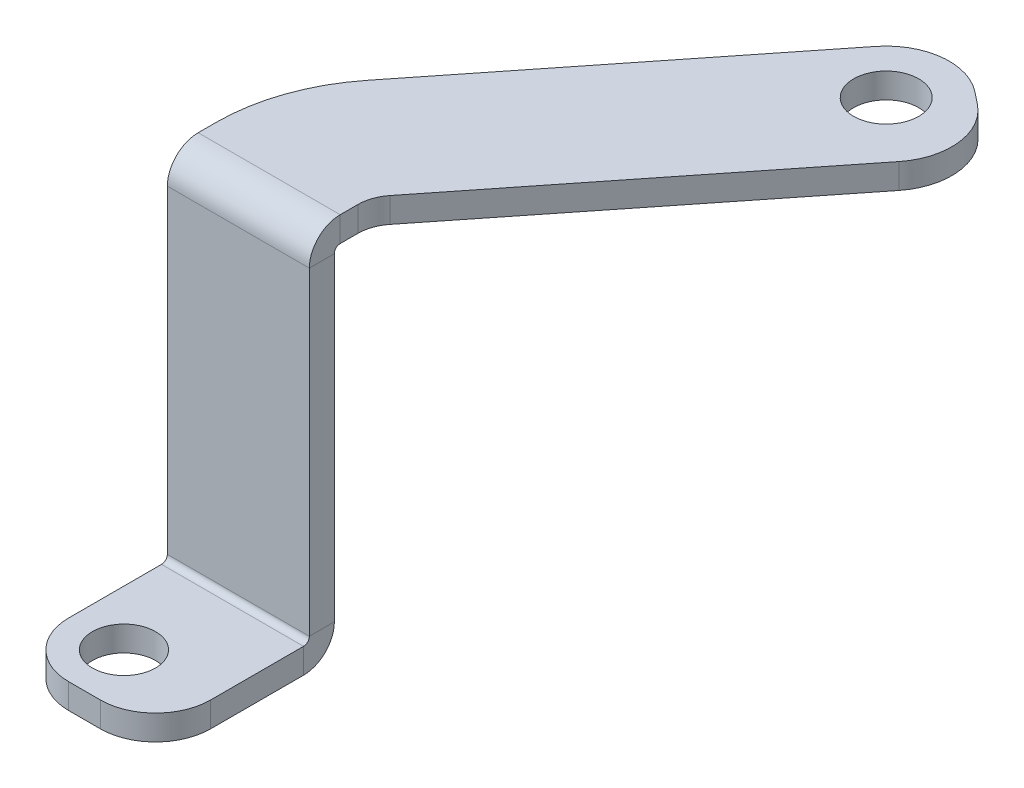
ISO-10303-21;
HEADER;
FILE_DESCRIPTION(('STEP AP214'),'2;1');
FILE_NAME('part.step','',(''),(''),'','','');
FILE_SCHEMA(('AUTOMOTIVE_DESIGN { 1 0 10303 214 1 1 1 1 }'));
ENDSEC;
DATA;
#1=APPLICATION_CONTEXT('core data for automotive mechanical design processes');
#2=APPLICATION_PROTOCOL_DEFINITION('international standard','automotive_design',2000,#1);
#3=PRODUCT_CONTEXT('',#1,'mechanical');
#4=PRODUCT('Part','Part','',(#3));
#5=PRODUCT_RELATED_PRODUCT_CATEGORY('part','',(#4));
#6=PRODUCT_DEFINITION_FORMATION('','',#4);
#7=PRODUCT_DEFINITION_CONTEXT('part definition',#1,'design');
#8=PRODUCT_DEFINITION('design','',#6,#7);
#9=PRODUCT_DEFINITION_SHAPE('','',#8);
#10=(LENGTH_UNIT() NAMED_UNIT(*) SI_UNIT(.MILLI.,.METRE.));
#11=(NAMED_UNIT(*) PLANE_ANGLE_UNIT() SI_UNIT($,.RADIAN.));
#12=(NAMED_UNIT(*) SI_UNIT($,.STERADIAN.) SOLID_ANGLE_UNIT());
#13=UNCERTAINTY_MEASURE_WITH_UNIT(LENGTH_MEASURE(1.E-05),#10,'distance_accuracy_value','');
#14=(GEOMETRIC_REPRESENTATION_CONTEXT(3) GLOBAL_UNCERTAINTY_ASSIGNED_CONTEXT((#13)) GLOBAL_UNIT_ASSIGNED_CONTEXT((#10,
#11,#12)) REPRESENTATION_CONTEXT('',''));
#15=CARTESIAN_POINT('',(0.,0.,0.));
#16=DIRECTION('',(0.,0.,1.));
#17=DIRECTION('',(1.,0.,0.));
#18=AXIS2_PLACEMENT_3D('',#15,#16,#17);
#19=CARTESIAN_POINT('',(11.,0.,-15.675));
#20=DIRECTION('',(-1.,0.,0.));
#21=DIRECTION('',(0.,0.,1.));
#22=AXIS2_PLACEMENT_3D('',#19,#20,#21);
#23=PLANE('',#22);
#24=DIRECTION('',(0.,0.,1.));
#25=VECTOR('',#24,1.);
#26=CARTESIAN_POINT('',(11.,41.1509000000002,-15.6750000000001));
#27=LINE('',#26,#25);
#28=CARTESIAN_POINT('',(11.,41.1509000000002,-15.6750000000001));
#29=VERTEX_POINT('',#28);
#30=CARTESIAN_POINT('',(11.,41.1509000000002,-12.5000000000001));
#31=VERTEX_POINT('',#30);
#32=EDGE_CURVE('E284',#29,#31,#27,.T.);
#33=ORIENTED_EDGE('',*,*,#32,.T.);
#34=DIRECTION('',(0.,-1.,0.));
#35=VECTOR('',#34,1.);
#36=CARTESIAN_POINT('',(11.,0.,-12.5));
#37=LINE('',#36,#35);
#38=CARTESIAN_POINT('',(11.,0.736599999999989,-12.5));
#39=VERTEX_POINT('',#38);
#40=EDGE_CURVE('E309',#31,#39,#37,.T.);
#41=ORIENTED_EDGE('',*,*,#40,.T.);
#42=DIRECTION('',(0.,0.,-1.));
#43=VECTOR('',#42,1.);
#44=CARTESIAN_POINT('',(11.,0.736599999999997,-12.5));
#45=LINE('',#44,#43);
#46=CARTESIAN_POINT('',(11.,0.736599999999978,-15.675));
#47=VERTEX_POINT('',#46);
#48=EDGE_CURVE('E296',#39,#47,#45,.T.);
#49=ORIENTED_EDGE('',*,*,#48,.T.);
#50=DIRECTION('',(0.,-1.,0.));
#51=VECTOR('',#50,1.);
#52=CARTESIAN_POINT('',(11.,0.,-15.675));
#53=LINE('',#52,#51);
#54=EDGE_CURVE('E310',#29,#47,#53,.T.);
#55=ORIENTED_EDGE('',*,*,#54,.F.);
#56=EDGE_LOOP('',(#33,#41,#49,#55));
#57=FACE_BOUND('',#56,.T.);
#58=ADVANCED_FACE('F43',(#57),#23,.F.);
#59=CARTESIAN_POINT('',(-7.,41.8875000000002,-15.6750000000001));
#60=DIRECTION('',(1.,0.,0.));
#61=DIRECTION('',(0.,0.,-1.));
#62=AXIS2_PLACEMENT_3D('',#59,#60,#61);
#63=PLANE('',#62);
#64=DIRECTION('',(0.,0.,1.));
#65=VECTOR('',#64,1.);
#66=CARTESIAN_POINT('',(-7.,41.1509000000002,-15.6750000000001));
#67=LINE('',#66,#65);
#68=CARTESIAN_POINT('',(-7.,41.1509000000002,-15.6750000000001));
#69=VERTEX_POINT('',#68);
#70=CARTESIAN_POINT('',(-7.,41.1509000000002,-12.5000000000001));
#71=VERTEX_POINT('',#70);
#72=EDGE_CURVE('E294',#69,#71,#67,.T.);
#73=ORIENTED_EDGE('',*,*,#72,.F.);
#74=DIRECTION('',(0.,1.,0.));
#75=VECTOR('',#74,1.);
#76=CARTESIAN_POINT('',(-7.,41.8875000000002,-15.6750000000001));
#77=LINE('',#76,#75);
#78=CARTESIAN_POINT('',(-7.,0.736600000000017,-15.675));
#79=VERTEX_POINT('',#78);
#80=EDGE_CURVE('E312',#79,#69,#77,.T.);
#81=ORIENTED_EDGE('',*,*,#80,.F.);
#82=DIRECTION('',(0.,0.,-1.));
#83=VECTOR('',#82,1.);
#84=CARTESIAN_POINT('',(-7.,0.736599999999995,-12.5));
#85=LINE('',#84,#83);
#86=CARTESIAN_POINT('',(-7.,0.736599999999988,-12.5));
#87=VERTEX_POINT('',#86);
#88=EDGE_CURVE('E301',#87,#79,#85,.T.);
#89=ORIENTED_EDGE('',*,*,#88,.F.);
#90=DIRECTION('',(0.,1.,0.));
#91=VECTOR('',#90,1.);
#92=CARTESIAN_POINT('',(-7.,41.8875000000002,-12.5000000000001));
#93=LINE('',#92,#91);
#94=EDGE_CURVE('E313',#87,#71,#93,.T.);
#95=ORIENTED_EDGE('',*,*,#94,.T.);
#96=EDGE_LOOP('',(#73,#81,#89,#95));
#97=FACE_BOUND('',#96,.T.);
#98=ADVANCED_FACE('F417',(#97),#63,.F.);
#99=CARTESIAN_POINT('',(0.,0.,-15.675));
#100=DIRECTION('',(0.,0.,1.));
#101=DIRECTION('',(0.,-1.,0.));
#102=AXIS2_PLACEMENT_3D('',#99,#100,#101);
#103=PLANE('',#102);
#104=DIRECTION('',(1.,0.,0.));
#105=VECTOR('',#104,1.);
#106=CARTESIAN_POINT('',(11.,41.1509000000002,-15.6750000000001));
#107=LINE('',#106,#105);
#108=EDGE_CURVE('E290',#29,#69,#107,.F.);
#109=ORIENTED_EDGE('',*,*,#108,.F.);
#110=ORIENTED_EDGE('',*,*,#54,.T.);
#111=DIRECTION('',(1.,0.,0.));
#112=VECTOR('',#111,1.);
#113=CARTESIAN_POINT('',(0.,0.736600000000018,-15.675));
#114=LINE('',#113,#112);
#115=EDGE_CURVE('E304',#79,#47,#114,.T.);
#116=ORIENTED_EDGE('',*,*,#115,.F.);
#117=ORIENTED_EDGE('',*,*,#80,.T.);
#118=EDGE_LOOP('',(#109,#110,#116,#117));
#119=FACE_BOUND('',#118,.T.);
#120=ADVANCED_FACE('F420',(#119),#103,.F.);
#121=CARTESIAN_POINT('',(0.,0.,-12.5));
#122=DIRECTION('',(0.,0.,1.));
#123=DIRECTION('',(0.,-1.,0.));
#124=AXIS2_PLACEMENT_3D('',#121,#122,#123);
#125=PLANE('',#124);
#126=ORIENTED_EDGE('',*,*,#40,.F.);
#127=DIRECTION('',(1.,0.,0.));
#128=VECTOR('',#127,1.);
#129=CARTESIAN_POINT('',(11.,41.1509000000002,-12.5000000000001));
#130=LINE('',#129,#128);
#131=EDGE_CURVE('E279',#31,#71,#130,.F.);
#132=ORIENTED_EDGE('',*,*,#131,.T.);
#133=ORIENTED_EDGE('',*,*,#94,.F.);
#134=DIRECTION('',(-1.,0.,0.));
#135=VECTOR('',#134,1.);
#136=CARTESIAN_POINT('',(11.,0.736599999999997,-12.5));
#137=LINE('',#136,#135);
#138=EDGE_CURVE('E299',#39,#87,#137,.T.);
#139=ORIENTED_EDGE('',*,*,#138,.F.);
#140=EDGE_LOOP('',(#126,#132,#133,#139));
#141=FACE_BOUND('',#140,.T.);
#142=ADVANCED_FACE('F408',(#141),#125,.T.);
#143=CARTESIAN_POINT('',(-7.,-3.175,-12.5));
#144=DIRECTION('',(-1.,0.,0.));
#145=DIRECTION('',(0.,0.,1.));
#146=AXIS2_PLACEMENT_3D('',#143,#144,#145);
#147=PLANE('',#146);
#148=DIRECTION('',(0.,0.,1.));
#149=VECTOR('',#148,1.);
#150=CARTESIAN_POINT('',(-7.,0.,-12.5));
#151=LINE('',#150,#149);
#152=CARTESIAN_POINT('',(-7.,0.,-11.7634));
#153=VERTEX_POINT('',#152);
#154=CARTESIAN_POINT('',(-7.,0.,0.));
#155=VERTEX_POINT('',#154);
#156=EDGE_CURVE('E344',#153,#155,#151,.T.);
#157=ORIENTED_EDGE('',*,*,#156,.F.);
#158=DIRECTION('',(0.,-1.,0.));
#159=VECTOR('',#158,1.);
#160=CARTESIAN_POINT('',(-7.,0.,-11.7634));
#161=LINE('',#160,#159);
#162=CARTESIAN_POINT('',(-7.,-3.17500000000001,-11.7634));
#163=VERTEX_POINT('',#162);
#164=EDGE_CURVE('E326',#153,#163,#161,.T.);
#165=ORIENTED_EDGE('',*,*,#164,.T.);
#166=DIRECTION('',(0.,0.,1.));
#167=VECTOR('',#166,1.);
#168=CARTESIAN_POINT('',(-7.,-3.175,-12.5));
#169=LINE('',#168,#167);
#170=CARTESIAN_POINT('',(-7.,-3.175,0.));
#171=VERTEX_POINT('',#170);
#172=EDGE_CURVE('E347',#163,#171,#169,.T.);
#173=ORIENTED_EDGE('',*,*,#172,.T.);
#174=DIRECTION('',(0.,1.,0.));
#175=VECTOR('',#174,1.);
#176=CARTESIAN_POINT('',(-7.,-3.175,0.));
#177=LINE('',#176,#175);
#178=EDGE_CURVE('E47',#171,#155,#177,.T.);
#179=ORIENTED_EDGE('',*,*,#178,.T.);
#180=EDGE_LOOP('',(#157,#165,#173,#179));
#181=FACE_BOUND('',#180,.T.);
#182=ADVANCED_FACE('F45',(#181),#147,.T.);
#183=CARTESIAN_POINT('',(0.,-3.175,0.));
#184=DIRECTION('',(0.,1.,0.));
#185=DIRECTION('',(0.,0.,1.));
#186=AXIS2_PLACEMENT_3D('',#183,#184,#185);
#187=PLANE('',#186);
#188=CARTESIAN_POINT('',(0.,-3.175,0.));
#189=DIRECTION('',(0.,1.,0.));
#190=DIRECTION('',(0.,0.,1.));
#191=AXIS2_PLACEMENT_3D('',#188,#189,#190);
#192=CIRCLE('',#191,4.);
#193=CARTESIAN_POINT('',(0.,-3.175,4.));
#194=VERTEX_POINT('',#193);
#195=EDGE_CURVE('E341',#194,#194,#192,.T.);
#196=ORIENTED_EDGE('',*,*,#195,.T.);
#197=EDGE_LOOP('',(#196));
#198=FACE_BOUND('',#197,.T.);
#199=DIRECTION('',(-1.,0.,0.));
#200=VECTOR('',#199,1.);
#201=CARTESIAN_POINT('',(-7.,-3.17500000000001,-11.7634));
#202=LINE('',#201,#200);
#203=CARTESIAN_POINT('',(11.,-3.175,-11.7634));
#204=VERTEX_POINT('',#203);
#205=EDGE_CURVE('E320',#163,#204,#202,.F.);
#206=ORIENTED_EDGE('',*,*,#205,.T.);
#207=DIRECTION('',(0.,0.,-1.));
#208=VECTOR('',#207,1.);
#209=CARTESIAN_POINT('',(11.,-3.175,0.));
#210=LINE('',#209,#208);
#211=CARTESIAN_POINT('',(11.,-3.175,0.));
#212=VERTEX_POINT('',#211);
#213=EDGE_CURVE('E359',#212,#204,#210,.T.);
#214=ORIENTED_EDGE('',*,*,#213,.F.);
#215=CARTESIAN_POINT('',(4.,-3.175,0.));
#216=DIRECTION('',(0.,1.,0.));
#217=DIRECTION('',(0.,0.,1.));
#218=AXIS2_PLACEMENT_3D('',#215,#216,#217);
#219=CIRCLE('',#218,7.);
#220=CARTESIAN_POINT('',(4.,-3.175,7.));
#221=VERTEX_POINT('',#220);
#222=EDGE_CURVE('E356',#221,#212,#219,.T.);
#223=ORIENTED_EDGE('',*,*,#222,.F.);
#224=DIRECTION('',(1.,0.,0.));
#225=VECTOR('',#224,1.);
#226=CARTESIAN_POINT('',(0.,-3.175,7.));
#227=LINE('',#226,#225);
#228=CARTESIAN_POINT('',(0.,-3.175,7.));
#229=VERTEX_POINT('',#228);
#230=EDGE_CURVE('E353',#229,#221,#227,.T.);
#231=ORIENTED_EDGE('',*,*,#230,.F.);
#232=CARTESIAN_POINT('',(0.,-3.175,0.));
#233=DIRECTION('',(0.,1.,0.));
#234=DIRECTION('',(0.,0.,1.));
#235=AXIS2_PLACEMENT_3D('',#232,#233,#234);
#236=CIRCLE('',#235,7.);
#237=EDGE_CURVE('E349',#171,#229,#236,.T.);
#238=ORIENTED_EDGE('',*,*,#237,.F.);
#239=ORIENTED_EDGE('',*,*,#172,.F.);
#240=EDGE_LOOP('',(#206,#214,#223,#231,#238,#239));
#241=FACE_BOUND('',#240,.T.);
#242=ADVANCED_FACE('F425',(#198,#241),#187,.F.);
#243=CARTESIAN_POINT('',(0.,0.,0.));
#244=DIRECTION('',(0.,1.,0.));
#245=DIRECTION('',(0.,0.,1.));
#246=AXIS2_PLACEMENT_3D('',#243,#244,#245);
#247=PLANE('',#246);
#248=CARTESIAN_POINT('',(0.,0.,0.));
#249=DIRECTION('',(0.,1.,0.));
#250=DIRECTION('',(0.,0.,1.));
#251=AXIS2_PLACEMENT_3D('',#248,#249,#250);
#252=CIRCLE('',#251,4.);
#253=CARTESIAN_POINT('',(0.,0.,4.));
#254=VERTEX_POINT('',#253);
#255=EDGE_CURVE('E338',#254,#254,#252,.T.);
#256=ORIENTED_EDGE('',*,*,#255,.F.);
#257=EDGE_LOOP('',(#256));
#258=FACE_BOUND('',#257,.T.);
#259=DIRECTION('',(0.,0.,-1.));
#260=VECTOR('',#259,1.);
#261=CARTESIAN_POINT('',(11.,0.,0.));
#262=LINE('',#261,#260);
#263=CARTESIAN_POINT('',(11.,0.,0.));
#264=VERTEX_POINT('',#263);
#265=CARTESIAN_POINT('',(11.,0.,-11.7634));
#266=VERTEX_POINT('',#265);
#267=EDGE_CURVE('E350',#264,#266,#262,.T.);
#268=ORIENTED_EDGE('',*,*,#267,.T.);
#269=DIRECTION('',(-1.,0.,0.));
#270=VECTOR('',#269,1.);
#271=CARTESIAN_POINT('',(-7.,0.,-11.7634));
#272=LINE('',#271,#270);
#273=EDGE_CURVE('E68',#153,#266,#272,.F.);
#274=ORIENTED_EDGE('',*,*,#273,.F.);
#275=ORIENTED_EDGE('',*,*,#156,.T.);
#276=CARTESIAN_POINT('',(0.,0.,0.));
#277=DIRECTION('',(0.,1.,0.));
#278=DIRECTION('',(0.,0.,1.));
#279=AXIS2_PLACEMENT_3D('',#276,#277,#278);
#280=CIRCLE('',#279,7.);
#281=CARTESIAN_POINT('',(0.,0.,7.));
#282=VERTEX_POINT('',#281);
#283=EDGE_CURVE('E363',#155,#282,#280,.T.);
#284=ORIENTED_EDGE('',*,*,#283,.T.);
#285=DIRECTION('',(1.,0.,0.));
#286=VECTOR('',#285,1.);
#287=CARTESIAN_POINT('',(0.,0.,7.));
#288=LINE('',#287,#286);
#289=CARTESIAN_POINT('',(4.,0.,7.));
#290=VERTEX_POINT('',#289);
#291=EDGE_CURVE('E366',#282,#290,#288,.T.);
#292=ORIENTED_EDGE('',*,*,#291,.T.);
#293=CARTESIAN_POINT('',(4.,0.,0.));
#294=DIRECTION('',(0.,1.,0.));
#295=DIRECTION('',(0.,0.,1.));
#296=AXIS2_PLACEMENT_3D('',#293,#294,#295);
#297=CIRCLE('',#296,7.);
#298=EDGE_CURVE('E369',#290,#264,#297,.T.);
#299=ORIENTED_EDGE('',*,*,#298,.T.);
#300=EDGE_LOOP('',(#268,#274,#275,#284,#292,#299));
#301=FACE_BOUND('',#300,.T.);
#302=ADVANCED_FACE('F383',(#258,#301),#247,.T.);
#303=CARTESIAN_POINT('',(11.,-3.175,0.));
#304=DIRECTION('',(1.,0.,0.));
#305=DIRECTION('',(0.,0.,-1.));
#306=AXIS2_PLACEMENT_3D('',#303,#304,#305);
#307=PLANE('',#306);
#308=DIRECTION('',(0.,-1.,0.));
#309=VECTOR('',#308,1.);
#310=CARTESIAN_POINT('',(11.,0.,-11.7634));
#311=LINE('',#310,#309);
#312=EDGE_CURVE('E335',#266,#204,#311,.T.);
#313=ORIENTED_EDGE('',*,*,#312,.F.);
#314=ORIENTED_EDGE('',*,*,#267,.F.);
#315=DIRECTION('',(0.,1.,0.));
#316=VECTOR('',#315,1.);
#317=CARTESIAN_POINT('',(11.,-3.175,0.));
#318=LINE('',#317,#316);
#319=EDGE_CURVE('E11',#212,#264,#318,.T.);
#320=ORIENTED_EDGE('',*,*,#319,.F.);
#321=ORIENTED_EDGE('',*,*,#213,.T.);
#322=EDGE_LOOP('',(#313,#314,#320,#321));
#323=FACE_BOUND('',#322,.T.);
#324=ADVANCED_FACE('F394',(#323),#307,.T.);
#325=CARTESIAN_POINT('',(4.,-3.175,0.));
#326=DIRECTION('',(0.,1.,0.));
#327=DIRECTION('',(0.,0.,1.));
#328=AXIS2_PLACEMENT_3D('',#325,#326,#327);
#329=CYLINDRICAL_SURFACE('',#328,7.);
#330=ORIENTED_EDGE('',*,*,#298,.F.);
#331=DIRECTION('',(0.,1.,0.));
#332=VECTOR('',#331,1.);
#333=CARTESIAN_POINT('',(4.,-3.175,7.));
#334=LINE('',#333,#332);
#335=EDGE_CURVE('E52',#221,#290,#334,.T.);
#336=ORIENTED_EDGE('',*,*,#335,.F.);
#337=ORIENTED_EDGE('',*,*,#222,.T.);
#338=ORIENTED_EDGE('',*,*,#319,.T.);
#339=EDGE_LOOP('',(#330,#336,#337,#338));
#340=FACE_BOUND('',#339,.T.);
#341=ADVANCED_FACE('F391',(#340),#329,.T.);
#342=CARTESIAN_POINT('',(0.,-3.175,7.));
#343=DIRECTION('',(0.,0.,1.));
#344=DIRECTION('',(1.,0.,0.));
#345=AXIS2_PLACEMENT_3D('',#342,#343,#344);
#346=PLANE('',#345);
#347=ORIENTED_EDGE('',*,*,#291,.F.);
#348=DIRECTION('',(0.,1.,0.));
#349=VECTOR('',#348,1.);
#350=CARTESIAN_POINT('',(0.,-3.175,7.));
#351=LINE('',#350,#349);
#352=EDGE_CURVE('E373',#229,#282,#351,.T.);
#353=ORIENTED_EDGE('',*,*,#352,.F.);
#354=ORIENTED_EDGE('',*,*,#230,.T.);
#355=ORIENTED_EDGE('',*,*,#335,.T.);
#356=EDGE_LOOP('',(#347,#353,#354,#355));
#357=FACE_BOUND('',#356,.T.);
#358=ADVANCED_FACE('F387',(#357),#346,.T.);
#359=CARTESIAN_POINT('',(0.,-3.175,0.));
#360=DIRECTION('',(0.,1.,0.));
#361=DIRECTION('',(0.,0.,1.));
#362=AXIS2_PLACEMENT_3D('',#359,#360,#361);
#363=CYLINDRICAL_SURFACE('',#362,7.);
#364=ORIENTED_EDGE('',*,*,#283,.F.);
#365=ORIENTED_EDGE('',*,*,#178,.F.);
#366=ORIENTED_EDGE('',*,*,#237,.T.);
#367=ORIENTED_EDGE('',*,*,#352,.T.);
#368=EDGE_LOOP('',(#364,#365,#366,#367));
#369=FACE_BOUND('',#368,.T.);
#370=ADVANCED_FACE('F382',(#369),#363,.T.);
#371=CARTESIAN_POINT('',(0.,-3.175,0.));
#372=DIRECTION('',(0.,1.,0.));
#373=DIRECTION('',(0.,0.,1.));
#374=AXIS2_PLACEMENT_3D('',#371,#372,#373);
#375=CYLINDRICAL_SURFACE('',#374,4.);
#376=ORIENTED_EDGE('',*,*,#195,.F.);
#377=EDGE_LOOP('',(#376));
#378=FACE_BOUND('',#377,.T.);
#379=ORIENTED_EDGE('',*,*,#255,.T.);
#380=EDGE_LOOP('',(#379));
#381=FACE_BOUND('',#380,.T.);
#382=ADVANCED_FACE('F451',(#378,#381),#375,.F.);
#383=CARTESIAN_POINT('',(11.,0.736599999999992,-11.7634));
#384=DIRECTION('',(1.,0.,0.));
#385=DIRECTION('',(0.,1.,0.));
#386=AXIS2_PLACEMENT_3D('',#383,#384,#385);
#387=PLANE('',#386);
#388=ORIENTED_EDGE('',*,*,#48,.F.);
#389=CARTESIAN_POINT('',(11.,0.736599999999992,-11.7634));
#390=DIRECTION('',(-1.,0.,0.));
#391=DIRECTION('',(0.,-1.,0.));
#392=AXIS2_PLACEMENT_3D('',#389,#390,#391);
#393=CIRCLE('',#392,0.7366);
#394=EDGE_CURVE('E329',#266,#39,#393,.F.);
#395=ORIENTED_EDGE('',*,*,#394,.F.);
#396=ORIENTED_EDGE('',*,*,#312,.T.);
#397=CARTESIAN_POINT('',(11.,0.736599999999992,-11.7634));
#398=DIRECTION('',(-1.,0.,0.));
#399=DIRECTION('',(0.,-1.,0.));
#400=AXIS2_PLACEMENT_3D('',#397,#398,#399);
#401=CIRCLE('',#400,3.9116);
#402=EDGE_CURVE('E322',#204,#47,#401,.F.);
#403=ORIENTED_EDGE('',*,*,#402,.T.);
#404=EDGE_LOOP('',(#388,#395,#396,#403));
#405=FACE_BOUND('',#404,.T.);
#406=ADVANCED_FACE('F402',(#405),#387,.T.);
#407=CARTESIAN_POINT('',(-7.,0.73659999999999,-11.7634));
#408=DIRECTION('',(1.,0.,0.));
#409=DIRECTION('',(0.,1.,0.));
#410=AXIS2_PLACEMENT_3D('',#407,#408,#409);
#411=PLANE('',#410);
#412=CARTESIAN_POINT('',(-7.,0.73659999999999,-11.7634));
#413=DIRECTION('',(-1.,0.,0.));
#414=DIRECTION('',(0.,-1.,0.));
#415=AXIS2_PLACEMENT_3D('',#412,#413,#414);
#416=CIRCLE('',#415,0.7366);
#417=EDGE_CURVE('E316',#87,#153,#416,.T.);
#418=ORIENTED_EDGE('',*,*,#417,.F.);
#419=ORIENTED_EDGE('',*,*,#88,.T.);
#420=CARTESIAN_POINT('',(-7.,0.73659999999999,-11.7634));
#421=DIRECTION('',(-1.,0.,0.));
#422=DIRECTION('',(0.,-1.,0.));
#423=AXIS2_PLACEMENT_3D('',#420,#421,#422);
#424=CIRCLE('',#423,3.9116);
#425=EDGE_CURVE('E323',#79,#163,#424,.T.);
#426=ORIENTED_EDGE('',*,*,#425,.T.);
#427=ORIENTED_EDGE('',*,*,#164,.F.);
#428=EDGE_LOOP('',(#418,#419,#426,#427));
#429=FACE_BOUND('',#428,.T.);
#430=ADVANCED_FACE('F412',(#429),#411,.F.);
#431=CARTESIAN_POINT('',(-7.,0.73659999999999,-11.7634));
#432=DIRECTION('',(-1.,0.,0.));
#433=DIRECTION('',(0.,0.,-1.));
#434=AXIS2_PLACEMENT_3D('',#431,#432,#433);
#435=CYLINDRICAL_SURFACE('',#434,3.9116);
#436=ORIENTED_EDGE('',*,*,#205,.F.);
#437=ORIENTED_EDGE('',*,*,#425,.F.);
#438=ORIENTED_EDGE('',*,*,#115,.T.);
#439=ORIENTED_EDGE('',*,*,#402,.F.);
#440=EDGE_LOOP('',(#436,#437,#438,#439));
#441=FACE_BOUND('',#440,.T.);
#442=ADVANCED_FACE('F423',(#441),#435,.T.);
#443=CARTESIAN_POINT('',(-7.,0.73659999999999,-11.7634));
#444=DIRECTION('',(-1.,0.,0.));
#445=DIRECTION('',(0.,0.,-1.));
#446=AXIS2_PLACEMENT_3D('',#443,#444,#445);
#447=CYLINDRICAL_SURFACE('',#446,0.7366);
#448=ORIENTED_EDGE('',*,*,#273,.T.);
#449=ORIENTED_EDGE('',*,*,#394,.T.);
#450=ORIENTED_EDGE('',*,*,#138,.T.);
#451=ORIENTED_EDGE('',*,*,#417,.T.);
#452=EDGE_LOOP('',(#448,#449,#450,#451));
#453=FACE_BOUND('',#452,.T.);
#454=ADVANCED_FACE('F397',(#453),#447,.F.);
#455=CARTESIAN_POINT('',(-7.,41.1509000000002,-16.4116000000001));
#456=DIRECTION('',(-1.,0.,0.));
#457=DIRECTION('',(0.,0.,1.));
#458=AXIS2_PLACEMENT_3D('',#455,#456,#457);
#459=PLANE('',#458);
#460=DIRECTION('',(0.,1.,0.));
#461=VECTOR('',#460,1.);
#462=CARTESIAN_POINT('',(-7.,41.8875000000002,-16.4116000000001));
#463=LINE('',#462,#461);
#464=CARTESIAN_POINT('',(-7.,41.8875000000002,-16.4116000000001));
#465=VERTEX_POINT('',#464);
#466=CARTESIAN_POINT('',(-7.,45.0625000000002,-16.4116000000001));
#467=VERTEX_POINT('',#466);
#468=EDGE_CURVE('E248',#465,#467,#463,.T.);
#469=ORIENTED_EDGE('',*,*,#468,.F.);
#470=CARTESIAN_POINT('',(-7.,41.1509000000002,-16.4116000000001));
#471=DIRECTION('',(1.,0.,0.));
#472=DIRECTION('',(0.,0.,-1.));
#473=AXIS2_PLACEMENT_3D('',#470,#471,#472);
#474=CIRCLE('',#473,0.736599999999997);
#475=EDGE_CURVE('E287',#69,#465,#474,.F.);
#476=ORIENTED_EDGE('',*,*,#475,.F.);
#477=ORIENTED_EDGE('',*,*,#72,.T.);
#478=CARTESIAN_POINT('',(-7.,41.1509000000002,-16.4116000000001));
#479=DIRECTION('',(1.,0.,0.));
#480=DIRECTION('',(0.,0.,-1.));
#481=AXIS2_PLACEMENT_3D('',#478,#479,#480);
#482=CIRCLE('',#481,3.9116);
#483=EDGE_CURVE('E60',#71,#467,#482,.F.);
#484=ORIENTED_EDGE('',*,*,#483,.T.);
#485=EDGE_LOOP('',(#469,#476,#477,#484));
#486=FACE_BOUND('',#485,.T.);
#487=ADVANCED_FACE('F448',(#486),#459,.T.);
#488=CARTESIAN_POINT('',(11.,41.1509000000002,-16.4116000000001));
#489=DIRECTION('',(-1.,0.,0.));
#490=DIRECTION('',(0.,0.,1.));
#491=AXIS2_PLACEMENT_3D('',#488,#489,#490);
#492=PLANE('',#491);
#493=CARTESIAN_POINT('',(11.,41.1509000000002,-16.4116000000001));
#494=DIRECTION('',(1.,0.,0.));
#495=DIRECTION('',(0.,0.,-1.));
#496=AXIS2_PLACEMENT_3D('',#493,#494,#495);
#497=CIRCLE('',#496,0.736599999999997);
#498=CARTESIAN_POINT('',(11.,41.8875000000002,-16.4116000000001));
#499=VERTEX_POINT('',#498);
#500=EDGE_CURVE('E278',#499,#29,#497,.T.);
#501=ORIENTED_EDGE('',*,*,#500,.F.);
#502=DIRECTION('',(0.,1.,0.));
#503=VECTOR('',#502,1.);
#504=CARTESIAN_POINT('',(11.,41.8875000000002,-16.4116000000001));
#505=LINE('',#504,#503);
#506=CARTESIAN_POINT('',(11.,45.0625000000002,-16.4116000000001));
#507=VERTEX_POINT('',#506);
#508=EDGE_CURVE('E258',#499,#507,#505,.T.);
#509=ORIENTED_EDGE('',*,*,#508,.T.);
#510=CARTESIAN_POINT('',(11.,41.1509000000002,-16.4116000000001));
#511=DIRECTION('',(1.,0.,0.));
#512=DIRECTION('',(0.,0.,-1.));
#513=AXIS2_PLACEMENT_3D('',#510,#511,#512);
#514=CIRCLE('',#513,3.9116);
#515=EDGE_CURVE('E282',#507,#31,#514,.T.);
#516=ORIENTED_EDGE('',*,*,#515,.T.);
#517=ORIENTED_EDGE('',*,*,#32,.F.);
#518=EDGE_LOOP('',(#501,#509,#516,#517));
#519=FACE_BOUND('',#518,.T.);
#520=ADVANCED_FACE('F532',(#519),#492,.F.);
#521=CARTESIAN_POINT('',(11.,41.1509000000002,-16.4116000000001));
#522=DIRECTION('',(1.,0.,0.));
#523=DIRECTION('',(0.,1.,0.));
#524=AXIS2_PLACEMENT_3D('',#521,#522,#523);
#525=CYLINDRICAL_SURFACE('',#524,3.9116);
#526=ORIENTED_EDGE('',*,*,#131,.F.);
#527=ORIENTED_EDGE('',*,*,#515,.F.);
#528=DIRECTION('',(-1.,0.,0.));
#529=VECTOR('',#528,1.);
#530=CARTESIAN_POINT('',(0.,45.0625000000002,-16.4116000000001));
#531=LINE('',#530,#529);
#532=EDGE_CURVE('E261',#507,#467,#531,.T.);
#533=ORIENTED_EDGE('',*,*,#532,.T.);
#534=ORIENTED_EDGE('',*,*,#483,.F.);
#535=EDGE_LOOP('',(#526,#527,#533,#534));
#536=FACE_BOUND('',#535,.T.);
#537=ADVANCED_FACE('F543',(#536),#525,.T.);
#538=CARTESIAN_POINT('',(11.,41.1509000000002,-16.4116000000001));
#539=DIRECTION('',(1.,0.,0.));
#540=DIRECTION('',(0.,1.,0.));
#541=AXIS2_PLACEMENT_3D('',#538,#539,#540);
#542=CYLINDRICAL_SURFACE('',#541,0.736599999999997);
#543=ORIENTED_EDGE('',*,*,#108,.T.);
#544=ORIENTED_EDGE('',*,*,#475,.T.);
#545=DIRECTION('',(1.,0.,0.));
#546=VECTOR('',#545,1.);
#547=CARTESIAN_POINT('',(-7.,41.8875000000002,-16.4116000000001));
#548=LINE('',#547,#546);
#549=EDGE_CURVE('E256',#465,#499,#548,.T.);
#550=ORIENTED_EDGE('',*,*,#549,.T.);
#551=ORIENTED_EDGE('',*,*,#500,.T.);
#552=EDGE_LOOP('',(#543,#544,#550,#551));
#553=FACE_BOUND('',#552,.T.);
#554=ADVANCED_FACE('F554',(#553),#542,.F.);
#555=CARTESIAN_POINT('',(-7.,45.0625000000002,-15.6750000000001));
#556=DIRECTION('',(1.,0.,0.));
#557=DIRECTION('',(0.,0.,-1.));
#558=AXIS2_PLACEMENT_3D('',#555,#556,#557);
#559=PLANE('',#558);
#560=ORIENTED_EDGE('',*,*,#468,.T.);
#561=DIRECTION('',(0.,0.,1.));
#562=VECTOR('',#561,1.);
#563=CARTESIAN_POINT('',(-7.,45.0625000000002,-15.6750000000001));
#564=LINE('',#563,#562);
#565=CARTESIAN_POINT('',(-7.,45.0625000000002,-18.6750000000001));
#566=VERTEX_POINT('',#565);
#567=EDGE_CURVE('E266',#566,#467,#564,.T.);
#568=ORIENTED_EDGE('',*,*,#567,.F.);
#569=DIRECTION('',(0.,-1.,0.));
#570=VECTOR('',#569,1.);
#571=CARTESIAN_POINT('',(-7.,45.0625000000002,-18.6750000000001));
#572=LINE('',#571,#570);
#573=CARTESIAN_POINT('',(-7.,41.8875000000002,-18.6750000000001));
#574=VERTEX_POINT('',#573);
#575=EDGE_CURVE('E272',#566,#574,#572,.T.);
#576=ORIENTED_EDGE('',*,*,#575,.T.);
#577=DIRECTION('',(0.,0.,1.));
#578=VECTOR('',#577,1.);
#579=CARTESIAN_POINT('',(-7.,41.8875000000002,-15.6750000000001));
#580=LINE('',#579,#578);
#581=EDGE_CURVE('E265',#574,#465,#580,.T.);
#582=ORIENTED_EDGE('',*,*,#581,.T.);
#583=EDGE_LOOP('',(#560,#568,#576,#582));
#584=FACE_BOUND('',#583,.T.);
#585=ADVANCED_FACE('F564',(#584),#559,.F.);
#586=CARTESIAN_POINT('',(11.,45.0625000000002,-18.6750000000001));
#587=DIRECTION('',(-1.,0.,0.));
#588=DIRECTION('',(0.,-1.,0.));
#589=AXIS2_PLACEMENT_3D('',#586,#587,#588);
#590=PLANE('',#589);
#591=ORIENTED_EDGE('',*,*,#508,.F.);
#592=DIRECTION('',(0.,0.,-1.));
#593=VECTOR('',#592,1.);
#594=CARTESIAN_POINT('',(11.,41.8875000000002,-18.6750000000001));
#595=LINE('',#594,#593);
#596=CARTESIAN_POINT('',(11.,41.8875000000002,-18.6750000000002));
#597=VERTEX_POINT('',#596);
#598=EDGE_CURVE('E270',#499,#597,#595,.T.);
#599=ORIENTED_EDGE('',*,*,#598,.T.);
#600=DIRECTION('',(0.,-1.,0.));
#601=VECTOR('',#600,1.);
#602=CARTESIAN_POINT('',(11.,45.0625000000002,-18.6750000000001));
#603=LINE('',#602,#601);
#604=CARTESIAN_POINT('',(11.,45.0625000000002,-18.6750000000001));
#605=VERTEX_POINT('',#604);
#606=EDGE_CURVE('E209',#605,#597,#603,.T.);
#607=ORIENTED_EDGE('',*,*,#606,.F.);
#608=DIRECTION('',(0.,0.,-1.));
#609=VECTOR('',#608,1.);
#610=CARTESIAN_POINT('',(11.,45.0625000000002,-18.6750000000001));
#611=LINE('',#610,#609);
#612=EDGE_CURVE('E269',#507,#605,#611,.T.);
#613=ORIENTED_EDGE('',*,*,#612,.F.);
#614=EDGE_LOOP('',(#591,#599,#607,#613));
#615=FACE_BOUND('',#614,.T.);
#616=ADVANCED_FACE('F575',(#615),#590,.F.);
#617=CARTESIAN_POINT('',(0.,45.0625000000002,0.));
#618=DIRECTION('',(0.,-1.,0.));
#619=DIRECTION('',(0.,0.,-1.));
#620=AXIS2_PLACEMENT_3D('',#617,#618,#619);
#621=PLANE('',#620);
#622=ORIENTED_EDGE('',*,*,#532,.F.);
#623=ORIENTED_EDGE('',*,*,#612,.T.);
#624=CARTESIAN_POINT('',(15.814128330408,45.0625000000002,-18.6750000000002));
#625=DIRECTION('',(0.,-1.,0.));
#626=DIRECTION('',(0.,0.,1.));
#627=AXIS2_PLACEMENT_3D('',#624,#625,#626);
#628=CIRCLE('',#627,4.814128330408);
#629=CARTESIAN_POINT('',(12.0419072675091,45.0625000000002,-21.6660165218969));
#630=VERTEX_POINT('',#629);
#631=EDGE_CURVE('E231',#605,#630,#628,.T.);
#632=ORIENTED_EDGE('',*,*,#631,.T.);
#633=DIRECTION('',(0.621299707156584,0.,-0.783573017584923));
#634=VECTOR('',#633,1.);
#635=CARTESIAN_POINT('',(40.5857191165838,45.0625000000002,-57.6650046532704));
#636=LINE('',#635,#634);
#637=CARTESIAN_POINT('',(40.5857191165838,45.0625000000002,-57.6650046532704));
#638=VERTEX_POINT('',#637);
#639=EDGE_CURVE('E187',#630,#638,#636,.T.);
#640=ORIENTED_EDGE('',*,*,#639,.T.);
#641=CARTESIAN_POINT('',(34.3171349759044,45.0625000000002,-62.635402310523));
#642=DIRECTION('',(0.,1.,0.));
#643=DIRECTION('',(0.,0.,-1.));
#644=AXIS2_PLACEMENT_3D('',#641,#642,#643);
#645=CIRCLE('',#644,8.00000000000001);
#646=CARTESIAN_POINT('',(39.2875326331571,45.0625000000002,-68.9039864512024));
#647=VERTEX_POINT('',#646);
#648=EDGE_CURVE('E235',#638,#647,#645,.T.);
#649=ORIENTED_EDGE('',*,*,#648,.T.);
#650=DIRECTION('',(-0.783573017584922,0.,-0.621299707156586));
#651=VECTOR('',#650,1.);
#652=CARTESIAN_POINT('',(37.7203865979872,45.0625000000002,-70.1465858655156));
#653=LINE('',#652,#651);
#654=CARTESIAN_POINT('',(37.7203865979872,45.0625000000002,-70.1465858655156));
#655=VERTEX_POINT('',#654);
#656=EDGE_CURVE('E238',#647,#655,#653,.T.);
#657=ORIENTED_EDGE('',*,*,#656,.T.);
#658=CARTESIAN_POINT('',(32.7499889407345,45.0625000000002,-63.8780017248359));
#659=DIRECTION('',(0.,1.,0.));
#660=DIRECTION('',(0.,0.,-1.));
#661=AXIS2_PLACEMENT_3D('',#658,#659,#660);
#662=CIRCLE('',#661,8.00000000000024);
#663=CARTESIAN_POINT('',(26.4814048000552,45.0625000000002,-68.8483993820889));
#664=VERTEX_POINT('',#663);
#665=EDGE_CURVE('E241',#655,#664,#662,.T.);
#666=ORIENTED_EDGE('',*,*,#665,.T.);
#667=DIRECTION('',(-0.621299707156584,0.,0.783573017584923));
#668=VECTOR('',#667,1.);
#669=CARTESIAN_POINT('',(-2.0624070490195,45.0625000000002,-32.8494112507154));
#670=LINE('',#669,#668);
#671=CARTESIAN_POINT('',(-2.0624070490195,45.0625000000002,-32.8494112507154));
#672=VERTEX_POINT('',#671);
#673=EDGE_CURVE('E213',#664,#672,#670,.T.);
#674=ORIENTED_EDGE('',*,*,#673,.T.);
#675=CARTESIAN_POINT('',(15.814128330408,45.0625000000002,-18.6750000000002));
#676=DIRECTION('',(0.,1.,0.));
#677=DIRECTION('',(0.,0.,-1.));
#678=AXIS2_PLACEMENT_3D('',#675,#676,#677);
#679=CIRCLE('',#678,22.814128330408);
#680=EDGE_CURVE('E210',#672,#566,#679,.T.);
#681=ORIENTED_EDGE('',*,*,#680,.T.);
#682=ORIENTED_EDGE('',*,*,#567,.T.);
#683=EDGE_LOOP('',(#622,#623,#632,#640,#649,#657,#666,#674,#681,#682));
#684=FACE_BOUND('',#683,.T.);
#685=CARTESIAN_POINT('',(32.7499889407345,45.0625000000002,-63.8780017248359));
#686=DIRECTION('',(0.,1.,0.));
#687=DIRECTION('',(0.,0.,1.));
#688=AXIS2_PLACEMENT_3D('',#685,#686,#687);
#689=CIRCLE('',#688,4.125);
#690=CARTESIAN_POINT('',(32.7499889407345,45.0625000000002,-59.7530017248359));
#691=VERTEX_POINT('',#690);
#692=EDGE_CURVE('E216',#691,#691,#689,.T.);
#693=ORIENTED_EDGE('',*,*,#692,.F.);
#694=EDGE_LOOP('',(#693));
#695=FACE_BOUND('',#694,.T.);
#696=ADVANCED_FACE('F586',(#684,#695),#621,.F.);
#697=CARTESIAN_POINT('',(0.,41.8875000000002,0.));
#698=DIRECTION('',(0.,-1.,0.));
#699=DIRECTION('',(0.,0.,-1.));
#700=AXIS2_PLACEMENT_3D('',#697,#698,#699);
#701=PLANE('',#700);
#702=ORIENTED_EDGE('',*,*,#598,.F.);
#703=ORIENTED_EDGE('',*,*,#549,.F.);
#704=ORIENTED_EDGE('',*,*,#581,.F.);
#705=CARTESIAN_POINT('',(15.814128330408,41.8875000000002,-18.6750000000002));
#706=DIRECTION('',(0.,1.,0.));
#707=DIRECTION('',(0.,0.,-1.));
#708=AXIS2_PLACEMENT_3D('',#705,#706,#707);
#709=CIRCLE('',#708,22.814128330408);
#710=CARTESIAN_POINT('',(-2.0624070490195,41.8875000000002,-32.8494112507154));
#711=VERTEX_POINT('',#710);
#712=EDGE_CURVE('E193',#711,#574,#709,.T.);
#713=ORIENTED_EDGE('',*,*,#712,.F.);
#714=DIRECTION('',(-0.621299707156584,0.,0.783573017584923));
#715=VECTOR('',#714,1.);
#716=CARTESIAN_POINT('',(-2.0624070490195,41.8875000000002,-32.8494112507154));
#717=LINE('',#716,#715);
#718=CARTESIAN_POINT('',(26.4814048000552,41.8875000000002,-68.8483993820889));
#719=VERTEX_POINT('',#718);
#720=EDGE_CURVE('E226',#719,#711,#717,.T.);
#721=ORIENTED_EDGE('',*,*,#720,.F.);
#722=CARTESIAN_POINT('',(32.7499889407345,41.8875000000002,-63.8780017248359));
#723=DIRECTION('',(0.,1.,0.));
#724=DIRECTION('',(0.,0.,-1.));
#725=AXIS2_PLACEMENT_3D('',#722,#723,#724);
#726=CIRCLE('',#725,8.00000000000024);
#727=CARTESIAN_POINT('',(37.7203865979872,41.8875000000002,-70.1465858655156));
#728=VERTEX_POINT('',#727);
#729=EDGE_CURVE('E223',#728,#719,#726,.T.);
#730=ORIENTED_EDGE('',*,*,#729,.F.);
#731=DIRECTION('',(-0.783573017584922,0.,-0.621299707156586));
#732=VECTOR('',#731,1.);
#733=CARTESIAN_POINT('',(37.7203865979872,41.8875000000002,-70.1465858655156));
#734=LINE('',#733,#732);
#735=CARTESIAN_POINT('',(39.2875326331571,41.8875000000002,-68.9039864512024));
#736=VERTEX_POINT('',#735);
#737=EDGE_CURVE('E220',#736,#728,#734,.T.);
#738=ORIENTED_EDGE('',*,*,#737,.F.);
#739=CARTESIAN_POINT('',(34.3171349759044,41.8875000000002,-62.635402310523));
#740=DIRECTION('',(0.,1.,0.));
#741=DIRECTION('',(0.,0.,-1.));
#742=AXIS2_PLACEMENT_3D('',#739,#740,#741);
#743=CIRCLE('',#742,8.00000000000001);
#744=CARTESIAN_POINT('',(40.5857191165838,41.8875000000002,-57.6650046532704));
#745=VERTEX_POINT('',#744);
#746=EDGE_CURVE('E204',#745,#736,#743,.T.);
#747=ORIENTED_EDGE('',*,*,#746,.F.);
#748=DIRECTION('',(0.621299707156584,0.,-0.783573017584923));
#749=VECTOR('',#748,1.);
#750=CARTESIAN_POINT('',(40.5857191165838,41.8875000000002,-57.6650046532704));
#751=LINE('',#750,#749);
#752=CARTESIAN_POINT('',(12.0419072675091,41.8875000000002,-21.6660165218969));
#753=VERTEX_POINT('',#752);
#754=EDGE_CURVE('E185',#753,#745,#751,.T.);
#755=ORIENTED_EDGE('',*,*,#754,.F.);
#756=CARTESIAN_POINT('',(15.814128330408,41.8875000000002,-18.6750000000002));
#757=DIRECTION('',(0.,-1.,0.));
#758=DIRECTION('',(0.,0.,1.));
#759=AXIS2_PLACEMENT_3D('',#756,#757,#758);
#760=CIRCLE('',#759,4.814128330408);
#761=EDGE_CURVE('E201',#597,#753,#760,.T.);
#762=ORIENTED_EDGE('',*,*,#761,.F.);
#763=EDGE_LOOP('',(#702,#703,#704,#713,#721,#730,#738,#747,#755,#762));
#764=FACE_BOUND('',#763,.T.);
#765=CARTESIAN_POINT('',(32.7499889407345,41.8875000000002,-63.8780017248359));
#766=DIRECTION('',(0.,1.,0.));
#767=DIRECTION('',(0.,0.,1.));
#768=AXIS2_PLACEMENT_3D('',#765,#766,#767);
#769=CIRCLE('',#768,4.125);
#770=CARTESIAN_POINT('',(32.7499889407345,41.8875000000002,-59.7530017248359));
#771=VERTEX_POINT('',#770);
#772=EDGE_CURVE('E233',#771,#771,#769,.T.);
#773=ORIENTED_EDGE('',*,*,#772,.T.);
#774=EDGE_LOOP('',(#773));
#775=FACE_BOUND('',#774,.T.);
#776=ADVANCED_FACE('F199',(#764,#775),#701,.T.);
#777=CARTESIAN_POINT('',(15.814128330408,41.8875000000002,-18.6750000000002));
#778=DIRECTION('',(0.,1.,0.));
#779=DIRECTION('',(0.,0.,1.));
#780=AXIS2_PLACEMENT_3D('',#777,#778,#779);
#781=CYLINDRICAL_SURFACE('',#780,4.814128330408);
#782=ORIENTED_EDGE('',*,*,#631,.F.);
#783=ORIENTED_EDGE('',*,*,#606,.T.);
#784=ORIENTED_EDGE('',*,*,#761,.T.);
#785=DIRECTION('',(0.,1.,0.));
#786=VECTOR('',#785,1.);
#787=CARTESIAN_POINT('',(12.0419072675091,41.8875000000002,-21.6660165218969));
#788=LINE('',#787,#786);
#789=EDGE_CURVE('E182',#753,#630,#788,.T.);
#790=ORIENTED_EDGE('',*,*,#789,.T.);
#791=EDGE_LOOP('',(#782,#783,#784,#790));
#792=FACE_BOUND('',#791,.T.);
#793=ADVANCED_FACE('F207',(#792),#781,.F.);
#794=CARTESIAN_POINT('',(15.814128330408,41.8875000000002,-18.6750000000002));
#795=DIRECTION('',(0.,1.,0.));
#796=DIRECTION('',(0.,0.,1.));
#797=AXIS2_PLACEMENT_3D('',#794,#795,#796);
#798=CYLINDRICAL_SURFACE('',#797,22.814128330408);
#799=ORIENTED_EDGE('',*,*,#680,.F.);
#800=DIRECTION('',(0.,1.,0.));
#801=VECTOR('',#800,1.);
#802=CARTESIAN_POINT('',(-2.0624070490195,41.8875000000002,-32.8494112507154));
#803=LINE('',#802,#801);
#804=EDGE_CURVE('E246',#711,#672,#803,.T.);
#805=ORIENTED_EDGE('',*,*,#804,.F.);
#806=ORIENTED_EDGE('',*,*,#712,.T.);
#807=ORIENTED_EDGE('',*,*,#575,.F.);
#808=EDGE_LOOP('',(#799,#805,#806,#807));
#809=FACE_BOUND('',#808,.T.);
#810=ADVANCED_FACE('F621',(#809),#798,.T.);
#811=CARTESIAN_POINT('',(-2.0624070490195,41.8875000000002,-32.8494112507154));
#812=DIRECTION('',(-0.783573017584923,0.,-0.621299707156584));
#813=DIRECTION('',(-0.621299707156584,0.,0.783573017584924));
#814=AXIS2_PLACEMENT_3D('',#811,#812,#813);
#815=PLANE('',#814);
#816=ORIENTED_EDGE('',*,*,#673,.F.);
#817=DIRECTION('',(0.,1.,0.));
#818=VECTOR('',#817,1.);
#819=CARTESIAN_POINT('',(26.4814048000552,41.8875000000002,-68.8483993820889));
#820=LINE('',#819,#818);
#821=EDGE_CURVE('E249',#719,#664,#820,.T.);
#822=ORIENTED_EDGE('',*,*,#821,.F.);
#823=ORIENTED_EDGE('',*,*,#720,.T.);
#824=ORIENTED_EDGE('',*,*,#804,.T.);
#825=EDGE_LOOP('',(#816,#822,#823,#824));
#826=FACE_BOUND('',#825,.T.);
#827=ADVANCED_FACE('F630',(#826),#815,.T.);
#828=CARTESIAN_POINT('',(32.7499889407345,41.8875000000002,-63.8780017248359));
#829=DIRECTION('',(0.,1.,0.));
#830=DIRECTION('',(0.,0.,1.));
#831=AXIS2_PLACEMENT_3D('',#828,#829,#830);
#832=CYLINDRICAL_SURFACE('',#831,8.00000000000024);
#833=ORIENTED_EDGE('',*,*,#665,.F.);
#834=DIRECTION('',(0.,1.,0.));
#835=VECTOR('',#834,1.);
#836=CARTESIAN_POINT('',(37.7203865979872,41.8875000000002,-70.1465858655156));
#837=LINE('',#836,#835);
#838=EDGE_CURVE('E251',#728,#655,#837,.T.);
#839=ORIENTED_EDGE('',*,*,#838,.F.);
#840=ORIENTED_EDGE('',*,*,#729,.T.);
#841=ORIENTED_EDGE('',*,*,#821,.T.);
#842=EDGE_LOOP('',(#833,#839,#840,#841));
#843=FACE_BOUND('',#842,.T.);
#844=ADVANCED_FACE('F640',(#843),#832,.T.);
#845=CARTESIAN_POINT('',(37.7203865979872,41.8875000000002,-70.1465858655156));
#846=DIRECTION('',(0.621299707156586,0.,-0.783573017584922));
#847=DIRECTION('',(-0.783573017584922,0.,-0.621299707156586));
#848=AXIS2_PLACEMENT_3D('',#845,#846,#847);
#849=PLANE('',#848);
#850=ORIENTED_EDGE('',*,*,#656,.F.);
#851=DIRECTION('',(0.,1.,0.));
#852=VECTOR('',#851,1.);
#853=CARTESIAN_POINT('',(39.2875326331571,41.8875000000002,-68.9039864512024));
#854=LINE('',#853,#852);
#855=EDGE_CURVE('E253',#736,#647,#854,.T.);
#856=ORIENTED_EDGE('',*,*,#855,.F.);
#857=ORIENTED_EDGE('',*,*,#737,.T.);
#858=ORIENTED_EDGE('',*,*,#838,.T.);
#859=EDGE_LOOP('',(#850,#856,#857,#858));
#860=FACE_BOUND('',#859,.T.);
#861=ADVANCED_FACE('F650',(#860),#849,.T.);
#862=CARTESIAN_POINT('',(34.3171349759044,41.8875000000002,-62.635402310523));
#863=DIRECTION('',(0.,1.,0.));
#864=DIRECTION('',(0.,0.,1.));
#865=AXIS2_PLACEMENT_3D('',#862,#863,#864);
#866=CYLINDRICAL_SURFACE('',#865,8.00000000000001);
#867=ORIENTED_EDGE('',*,*,#648,.F.);
#868=DIRECTION('',(0.,1.,0.));
#869=VECTOR('',#868,1.);
#870=CARTESIAN_POINT('',(40.5857191165838,41.8875000000002,-57.6650046532704));
#871=LINE('',#870,#869);
#872=EDGE_CURVE('E192',#745,#638,#871,.T.);
#873=ORIENTED_EDGE('',*,*,#872,.F.);
#874=ORIENTED_EDGE('',*,*,#746,.T.);
#875=ORIENTED_EDGE('',*,*,#855,.T.);
#876=EDGE_LOOP('',(#867,#873,#874,#875));
#877=FACE_BOUND('',#876,.T.);
#878=ADVANCED_FACE('F660',(#877),#866,.T.);
#879=CARTESIAN_POINT('',(40.5857191165838,41.8875000000002,-57.6650046532704));
#880=DIRECTION('',(0.783573017584923,0.,0.621299707156584));
#881=DIRECTION('',(0.621299707156584,0.,-0.783573017584923));
#882=AXIS2_PLACEMENT_3D('',#879,#880,#881);
#883=PLANE('',#882);
#884=ORIENTED_EDGE('',*,*,#639,.F.);
#885=ORIENTED_EDGE('',*,*,#789,.F.);
#886=ORIENTED_EDGE('',*,*,#754,.T.);
#887=ORIENTED_EDGE('',*,*,#872,.T.);
#888=EDGE_LOOP('',(#884,#885,#886,#887));
#889=FACE_BOUND('',#888,.T.);
#890=ADVANCED_FACE('F184',(#889),#883,.T.);
#891=CARTESIAN_POINT('',(32.7499889407345,41.8875000000002,-63.8780017248359));
#892=DIRECTION('',(0.,1.,0.));
#893=DIRECTION('',(0.,0.,1.));
#894=AXIS2_PLACEMENT_3D('',#891,#892,#893);
#895=CYLINDRICAL_SURFACE('',#894,4.125);
#896=ORIENTED_EDGE('',*,*,#772,.F.);
#897=EDGE_LOOP('',(#896));
#898=FACE_BOUND('',#897,.T.);
#899=ORIENTED_EDGE('',*,*,#692,.T.);
#900=EDGE_LOOP('',(#899));
#901=FACE_BOUND('',#900,.T.);
#902=ADVANCED_FACE('F679',(#898,#901),#895,.F.);
#903=CLOSED_SHELL('',(#58,#98,#120,#142,#182,#242,#302,#324,#341,#358,#370,#382,#406,#430,#442,
#454,#487,#520,#537,#554,#585,#616,#696,#776,#793,#810,#827,#844,#861,#878,#890,#902));
#904=MANIFOLD_SOLID_BREP('B2',#903);
#905=ADVANCED_BREP_SHAPE_REPRESENTATION('',(#18,#904),#14);
#906=SHAPE_DEFINITION_REPRESENTATION(#9,#905);
ENDSEC;
END-ISO-10303-21;
